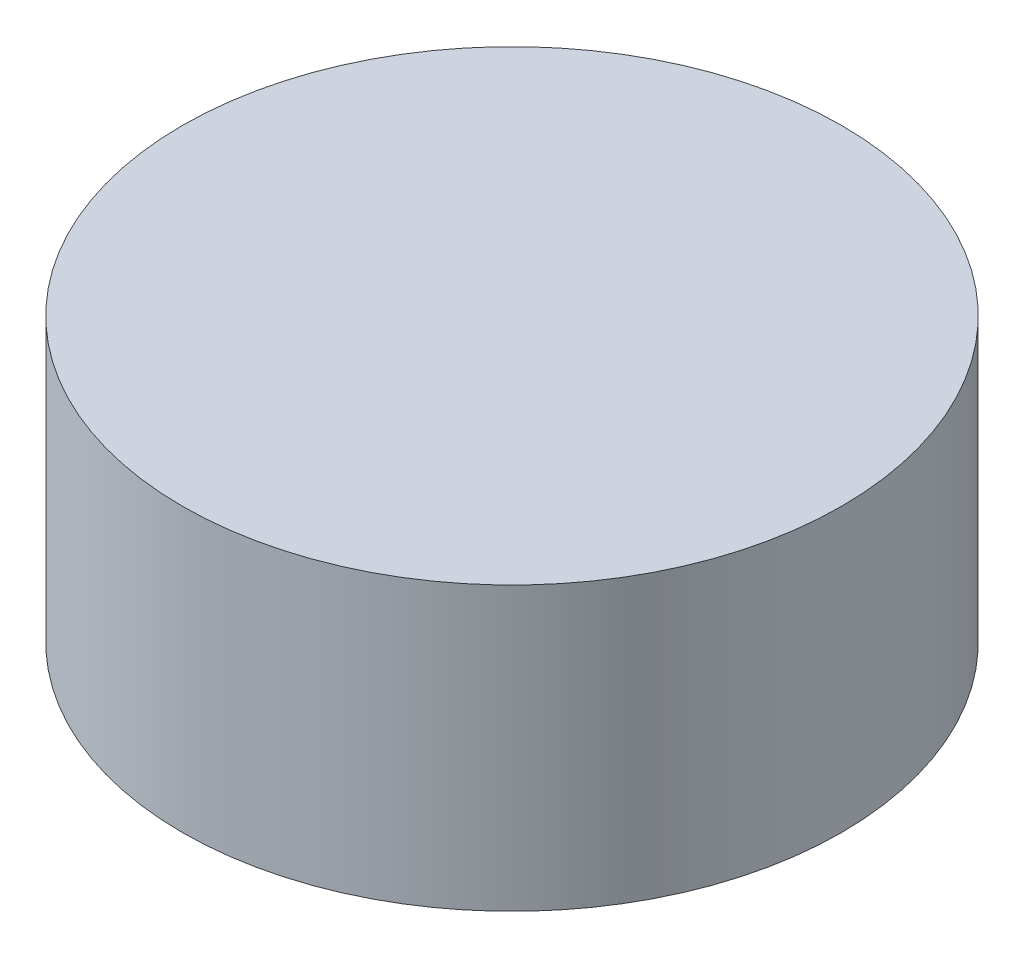
ISO-10303-21;
HEADER;
FILE_DESCRIPTION(('STEP AP214'),'2;1');
FILE_NAME('part.step','',(''),(''),'','','');
FILE_SCHEMA(('AUTOMOTIVE_DESIGN { 1 0 10303 214 1 1 1 1 }'));
ENDSEC;
DATA;
#1=APPLICATION_CONTEXT('core data for automotive mechanical design processes');
#2=APPLICATION_PROTOCOL_DEFINITION('international standard','automotive_design',2000,#1);
#3=PRODUCT_CONTEXT('',#1,'mechanical');
#4=PRODUCT('Part','Part','',(#3));
#5=PRODUCT_RELATED_PRODUCT_CATEGORY('part','',(#4));
#6=PRODUCT_DEFINITION_FORMATION('','',#4);
#7=PRODUCT_DEFINITION_CONTEXT('part definition',#1,'design');
#8=PRODUCT_DEFINITION('design','',#6,#7);
#9=PRODUCT_DEFINITION_SHAPE('','',#8);
#10=(LENGTH_UNIT() NAMED_UNIT(*) SI_UNIT(.MILLI.,.METRE.));
#11=(NAMED_UNIT(*) PLANE_ANGLE_UNIT() SI_UNIT($,.RADIAN.));
#12=(NAMED_UNIT(*) SI_UNIT($,.STERADIAN.) SOLID_ANGLE_UNIT());
#13=UNCERTAINTY_MEASURE_WITH_UNIT(LENGTH_MEASURE(1.E-05),#10,'distance_accuracy_value','');
#14=(GEOMETRIC_REPRESENTATION_CONTEXT(3) GLOBAL_UNCERTAINTY_ASSIGNED_CONTEXT((#13)) GLOBAL_UNIT_ASSIGNED_CONTEXT((#10,
#11,#12)) REPRESENTATION_CONTEXT('',''));
#15=CARTESIAN_POINT('',(0.,0.,0.));
#16=DIRECTION('',(0.,0.,1.));
#17=DIRECTION('',(1.,0.,0.));
#18=AXIS2_PLACEMENT_3D('',#15,#16,#17);
#19=CARTESIAN_POINT('',(0.,7.5,0.));
#20=DIRECTION('',(0.,-1.,0.));
#21=DIRECTION('',(0.,0.,-1.));
#22=AXIS2_PLACEMENT_3D('',#19,#20,#21);
#23=CYLINDRICAL_SURFACE('',#22,17.5);
#24=CARTESIAN_POINT('',(0.,7.5,0.));
#25=DIRECTION('',(0.,1.,0.));
#26=DIRECTION('',(0.,0.,1.));
#27=AXIS2_PLACEMENT_3D('',#24,#25,#26);
#28=CIRCLE('',#27,17.5);
#29=CARTESIAN_POINT('',(0.,7.5,17.5));
#30=VERTEX_POINT('',#29);
#31=EDGE_CURVE('E10',#30,#30,#28,.T.);
#32=ORIENTED_EDGE('',*,*,#31,.F.);
#33=EDGE_LOOP('',(#32));
#34=FACE_BOUND('',#33,.T.);
#35=CARTESIAN_POINT('',(0.,-7.5,0.));
#36=DIRECTION('',(0.,1.,0.));
#37=DIRECTION('',(0.,0.,1.));
#38=AXIS2_PLACEMENT_3D('',#35,#36,#37);
#39=CIRCLE('',#38,17.5);
#40=CARTESIAN_POINT('',(0.,-7.5,17.5));
#41=VERTEX_POINT('',#40);
#42=EDGE_CURVE('E33',#41,#41,#39,.T.);
#43=ORIENTED_EDGE('',*,*,#42,.T.);
#44=EDGE_LOOP('',(#43));
#45=FACE_BOUND('',#44,.T.);
#46=ADVANCED_FACE('F30',(#34,#45),#23,.T.);
#47=CARTESIAN_POINT('',(0.,7.5,0.));
#48=DIRECTION('',(0.,1.,0.));
#49=DIRECTION('',(0.,0.,1.));
#50=AXIS2_PLACEMENT_3D('',#47,#48,#49);
#51=PLANE('',#50);
#52=ORIENTED_EDGE('',*,*,#31,.T.);
#53=EDGE_LOOP('',(#52));
#54=FACE_BOUND('',#53,.T.);
#55=ADVANCED_FACE('F45',(#54),#51,.T.);
#56=CARTESIAN_POINT('',(0.,-7.5,0.));
#57=DIRECTION('',(0.,1.,0.));
#58=DIRECTION('',(0.,0.,1.));
#59=AXIS2_PLACEMENT_3D('',#56,#57,#58);
#60=PLANE('',#59);
#61=ORIENTED_EDGE('',*,*,#42,.F.);
#62=EDGE_LOOP('',(#61));
#63=FACE_BOUND('',#62,.T.);
#64=ADVANCED_FACE('F43',(#63),#60,.F.);
#65=CLOSED_SHELL('',(#46,#55,#64));
#66=MANIFOLD_SOLID_BREP('B2',#65);
#67=ADVANCED_BREP_SHAPE_REPRESENTATION('',(#18,#66),#14);
#68=SHAPE_DEFINITION_REPRESENTATION(#9,#67);
ENDSEC;
END-ISO-10303-21;
